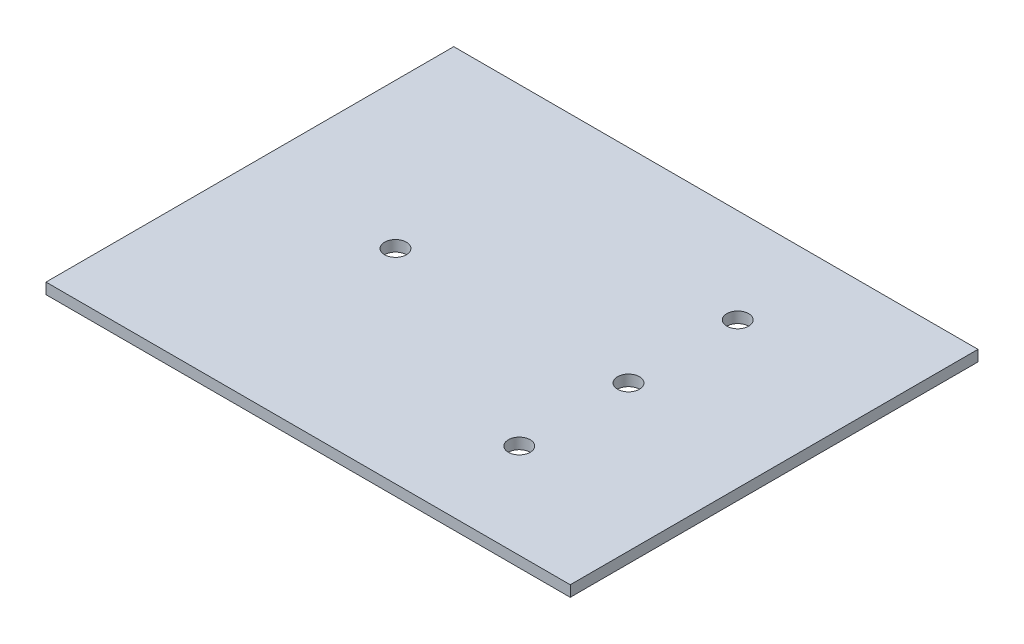
ISO-10303-21;
HEADER;
FILE_DESCRIPTION(('STEP AP214'),'2;1');
FILE_NAME('part.step','',(''),(''),'','','');
FILE_SCHEMA(('AUTOMOTIVE_DESIGN { 1 0 10303 214 1 1 1 1 }'));
ENDSEC;
DATA;
#1=APPLICATION_CONTEXT('core data for automotive mechanical design processes');
#2=APPLICATION_PROTOCOL_DEFINITION('international standard','automotive_design',2000,#1);
#3=PRODUCT_CONTEXT('',#1,'mechanical');
#4=PRODUCT('Part','Part','',(#3));
#5=PRODUCT_RELATED_PRODUCT_CATEGORY('part','',(#4));
#6=PRODUCT_DEFINITION_FORMATION('','',#4);
#7=PRODUCT_DEFINITION_CONTEXT('part definition',#1,'design');
#8=PRODUCT_DEFINITION('design','',#6,#7);
#9=PRODUCT_DEFINITION_SHAPE('','',#8);
#10=(LENGTH_UNIT() NAMED_UNIT(*) SI_UNIT(.MILLI.,.METRE.));
#11=(NAMED_UNIT(*) PLANE_ANGLE_UNIT() SI_UNIT($,.RADIAN.));
#12=(NAMED_UNIT(*) SI_UNIT($,.STERADIAN.) SOLID_ANGLE_UNIT());
#13=UNCERTAINTY_MEASURE_WITH_UNIT(LENGTH_MEASURE(1.E-05),#10,'distance_accuracy_value','');
#14=(GEOMETRIC_REPRESENTATION_CONTEXT(3) GLOBAL_UNCERTAINTY_ASSIGNED_CONTEXT((#13)) GLOBAL_UNIT_ASSIGNED_CONTEXT((#10,
#11,#12)) REPRESENTATION_CONTEXT('',''));
#15=CARTESIAN_POINT('',(0.,0.,0.));
#16=DIRECTION('',(0.,0.,1.));
#17=DIRECTION('',(1.,0.,0.));
#18=AXIS2_PLACEMENT_3D('',#15,#16,#17);
#19=CARTESIAN_POINT('',(-912.372794199772,9.525,-177.8));
#20=DIRECTION('',(0.,0.,-1.));
#21=DIRECTION('',(-1.,0.,0.));
#22=AXIS2_PLACEMENT_3D('',#19,#20,#21);
#23=PLANE('',#22);
#24=DIRECTION('',(1.,0.,0.));
#25=VECTOR('',#24,1.);
#26=CARTESIAN_POINT('',(-912.372794199772,0.,-177.8));
#27=LINE('',#26,#25);
#28=CARTESIAN_POINT('',(165.1,0.,-177.8));
#29=VERTEX_POINT('',#28);
#30=CARTESIAN_POINT('',(622.3,0.,-177.8));
#31=VERTEX_POINT('',#30);
#32=EDGE_CURVE('E40',#29,#31,#27,.T.);
#33=ORIENTED_EDGE('',*,*,#32,.F.);
#34=DIRECTION('',(0.,-1.,0.));
#35=VECTOR('',#34,1.);
#36=CARTESIAN_POINT('',(165.1,9.525,-177.8));
#37=LINE('',#36,#35);
#38=CARTESIAN_POINT('',(165.1,9.525,-177.8));
#39=VERTEX_POINT('',#38);
#40=EDGE_CURVE('E107',#39,#29,#37,.T.);
#41=ORIENTED_EDGE('',*,*,#40,.F.);
#42=DIRECTION('',(1.,0.,0.));
#43=VECTOR('',#42,1.);
#44=CARTESIAN_POINT('',(-912.372794199772,9.525,-177.8));
#45=LINE('',#44,#43);
#46=CARTESIAN_POINT('',(622.3,9.525,-177.8));
#47=VERTEX_POINT('',#46);
#48=EDGE_CURVE('E11',#39,#47,#45,.T.);
#49=ORIENTED_EDGE('',*,*,#48,.T.);
#50=DIRECTION('',(0.,-1.,0.));
#51=VECTOR('',#50,1.);
#52=CARTESIAN_POINT('',(622.3,9.525,-177.8));
#53=LINE('',#52,#51);
#54=EDGE_CURVE('E84',#47,#31,#53,.T.);
#55=ORIENTED_EDGE('',*,*,#54,.T.);
#56=EDGE_LOOP('',(#33,#41,#49,#55));
#57=FACE_BOUND('',#56,.T.);
#58=ADVANCED_FACE('F37',(#57),#23,.T.);
#59=CARTESIAN_POINT('',(-912.372794199772,9.525,0.));
#60=DIRECTION('',(0.,1.,0.));
#61=DIRECTION('',(0.,0.,1.));
#62=AXIS2_PLACEMENT_3D('',#59,#60,#61);
#63=PLANE('',#62);
#64=CARTESIAN_POINT('',(495.3,9.525,95.25));
#65=DIRECTION('',(0.,-1.,0.));
#66=DIRECTION('',(0.,0.,-1.));
#67=AXIS2_PLACEMENT_3D('',#64,#65,#66);
#68=CIRCLE('',#67,9.52500000000002);
#69=CARTESIAN_POINT('',(495.3,9.525,85.725));
#70=VERTEX_POINT('',#69);
#71=EDGE_CURVE('E153',#70,#70,#68,.T.);
#72=ORIENTED_EDGE('',*,*,#71,.T.);
#73=EDGE_LOOP('',(#72));
#74=FACE_BOUND('',#73,.T.);
#75=CARTESIAN_POINT('',(495.3,9.525,0.));
#76=DIRECTION('',(0.,-1.,0.));
#77=DIRECTION('',(0.,0.,-1.));
#78=AXIS2_PLACEMENT_3D('',#75,#76,#77);
#79=CIRCLE('',#78,9.52500000000002);
#80=CARTESIAN_POINT('',(495.3,9.525,-9.52500000000002));
#81=VERTEX_POINT('',#80);
#82=EDGE_CURVE('E161',#81,#81,#79,.T.);
#83=ORIENTED_EDGE('',*,*,#82,.T.);
#84=EDGE_LOOP('',(#83));
#85=FACE_BOUND('',#84,.T.);
#86=CARTESIAN_POINT('',(495.3,9.525,-95.25));
#87=DIRECTION('',(0.,-1.,0.));
#88=DIRECTION('',(0.,0.,-1.));
#89=AXIS2_PLACEMENT_3D('',#86,#87,#88);
#90=CIRCLE('',#89,9.52500000000002);
#91=CARTESIAN_POINT('',(495.3,9.525,-104.775));
#92=VERTEX_POINT('',#91);
#93=EDGE_CURVE('E167',#92,#92,#90,.T.);
#94=ORIENTED_EDGE('',*,*,#93,.T.);
#95=EDGE_LOOP('',(#94));
#96=FACE_BOUND('',#95,.T.);
#97=CARTESIAN_POINT('',(292.1,9.525,0.));
#98=DIRECTION('',(0.,-1.,0.));
#99=DIRECTION('',(0.,0.,-1.));
#100=AXIS2_PLACEMENT_3D('',#97,#98,#99);
#101=CIRCLE('',#100,9.52500000000002);
#102=CARTESIAN_POINT('',(292.1,9.525,-9.52500000000002));
#103=VERTEX_POINT('',#102);
#104=EDGE_CURVE('E93',#103,#103,#101,.T.);
#105=ORIENTED_EDGE('',*,*,#104,.T.);
#106=EDGE_LOOP('',(#105));
#107=FACE_BOUND('',#106,.T.);
#108=ORIENTED_EDGE('',*,*,#48,.F.);
#109=DIRECTION('',(0.,0.,-1.));
#110=VECTOR('',#109,1.);
#111=CARTESIAN_POINT('',(165.1,9.525,-450.66038433116));
#112=LINE('',#111,#110);
#113=CARTESIAN_POINT('',(165.1,9.525,177.8));
#114=VERTEX_POINT('',#113);
#115=EDGE_CURVE('E102',#114,#39,#112,.T.);
#116=ORIENTED_EDGE('',*,*,#115,.F.);
#117=DIRECTION('',(1.,0.,0.));
#118=VECTOR('',#117,1.);
#119=CARTESIAN_POINT('',(-912.372794199772,9.525,177.8));
#120=LINE('',#119,#118);
#121=CARTESIAN_POINT('',(622.3,9.525,177.8));
#122=VERTEX_POINT('',#121);
#123=EDGE_CURVE('E82',#114,#122,#120,.T.);
#124=ORIENTED_EDGE('',*,*,#123,.T.);
#125=DIRECTION('',(0.,0.,-1.));
#126=VECTOR('',#125,1.);
#127=CARTESIAN_POINT('',(622.299999999999,9.525,-450.66038433116));
#128=LINE('',#127,#126);
#129=EDGE_CURVE('E92',#122,#47,#128,.T.);
#130=ORIENTED_EDGE('',*,*,#129,.T.);
#131=EDGE_LOOP('',(#108,#116,#124,#130));
#132=FACE_BOUND('',#131,.T.);
#133=ADVANCED_FACE('F116',(#74,#85,#96,#107,#132),#63,.T.);
#134=CARTESIAN_POINT('',(-912.372794199772,0.,0.));
#135=DIRECTION('',(0.,1.,0.));
#136=DIRECTION('',(0.,0.,1.));
#137=AXIS2_PLACEMENT_3D('',#134,#135,#136);
#138=PLANE('',#137);
#139=CARTESIAN_POINT('',(495.3,0.,95.25));
#140=DIRECTION('',(0.,-1.,0.));
#141=DIRECTION('',(0.,0.,-1.));
#142=AXIS2_PLACEMENT_3D('',#139,#140,#141);
#143=CIRCLE('',#142,9.52500000000002);
#144=CARTESIAN_POINT('',(495.3,0.,85.725));
#145=VERTEX_POINT('',#144);
#146=EDGE_CURVE('E156',#145,#145,#143,.T.);
#147=ORIENTED_EDGE('',*,*,#146,.F.);
#148=EDGE_LOOP('',(#147));
#149=FACE_BOUND('',#148,.T.);
#150=CARTESIAN_POINT('',(495.3,0.,0.));
#151=DIRECTION('',(0.,-1.,0.));
#152=DIRECTION('',(0.,0.,-1.));
#153=AXIS2_PLACEMENT_3D('',#150,#151,#152);
#154=CIRCLE('',#153,9.52500000000002);
#155=CARTESIAN_POINT('',(495.3,0.,-9.52500000000002));
#156=VERTEX_POINT('',#155);
#157=EDGE_CURVE('E158',#156,#156,#154,.T.);
#158=ORIENTED_EDGE('',*,*,#157,.F.);
#159=EDGE_LOOP('',(#158));
#160=FACE_BOUND('',#159,.T.);
#161=CARTESIAN_POINT('',(495.3,0.,-95.25));
#162=DIRECTION('',(0.,-1.,0.));
#163=DIRECTION('',(0.,0.,-1.));
#164=AXIS2_PLACEMENT_3D('',#161,#162,#163);
#165=CIRCLE('',#164,9.52500000000002);
#166=CARTESIAN_POINT('',(495.3,0.,-104.775));
#167=VERTEX_POINT('',#166);
#168=EDGE_CURVE('E164',#167,#167,#165,.T.);
#169=ORIENTED_EDGE('',*,*,#168,.F.);
#170=EDGE_LOOP('',(#169));
#171=FACE_BOUND('',#170,.T.);
#172=CARTESIAN_POINT('',(292.1,0.,0.));
#173=DIRECTION('',(0.,-1.,0.));
#174=DIRECTION('',(0.,0.,-1.));
#175=AXIS2_PLACEMENT_3D('',#172,#173,#174);
#176=CIRCLE('',#175,9.52500000000002);
#177=CARTESIAN_POINT('',(292.1,0.,-9.52500000000002));
#178=VERTEX_POINT('',#177);
#179=EDGE_CURVE('E97',#178,#178,#176,.T.);
#180=ORIENTED_EDGE('',*,*,#179,.F.);
#181=EDGE_LOOP('',(#180));
#182=FACE_BOUND('',#181,.T.);
#183=DIRECTION('',(1.,0.,0.));
#184=VECTOR('',#183,1.);
#185=CARTESIAN_POINT('',(-912.372794199772,0.,177.8));
#186=LINE('',#185,#184);
#187=CARTESIAN_POINT('',(165.1,0.,177.8));
#188=VERTEX_POINT('',#187);
#189=CARTESIAN_POINT('',(622.3,0.,177.8));
#190=VERTEX_POINT('',#189);
#191=EDGE_CURVE('E63',#188,#190,#186,.T.);
#192=ORIENTED_EDGE('',*,*,#191,.F.);
#193=DIRECTION('',(0.,0.,-1.));
#194=VECTOR('',#193,1.);
#195=CARTESIAN_POINT('',(165.1,0.,-450.66038433116));
#196=LINE('',#195,#194);
#197=EDGE_CURVE('E80',#188,#29,#196,.T.);
#198=ORIENTED_EDGE('',*,*,#197,.T.);
#199=ORIENTED_EDGE('',*,*,#32,.T.);
#200=DIRECTION('',(0.,0.,-1.));
#201=VECTOR('',#200,1.);
#202=CARTESIAN_POINT('',(622.299999999999,0.,-450.66038433116));
#203=LINE('',#202,#201);
#204=EDGE_CURVE('E78',#190,#31,#203,.T.);
#205=ORIENTED_EDGE('',*,*,#204,.F.);
#206=EDGE_LOOP('',(#192,#198,#199,#205));
#207=FACE_BOUND('',#206,.T.);
#208=ADVANCED_FACE('F76',(#149,#160,#171,#182,#207),#138,.F.);
#209=CARTESIAN_POINT('',(-912.372794199772,9.525,177.8));
#210=DIRECTION('',(0.,0.,-1.));
#211=DIRECTION('',(-1.,0.,0.));
#212=AXIS2_PLACEMENT_3D('',#209,#210,#211);
#213=PLANE('',#212);
#214=ORIENTED_EDGE('',*,*,#191,.T.);
#215=DIRECTION('',(0.,-1.,0.));
#216=VECTOR('',#215,1.);
#217=CARTESIAN_POINT('',(622.3,9.525,177.8));
#218=LINE('',#217,#216);
#219=EDGE_CURVE('E87',#122,#190,#218,.T.);
#220=ORIENTED_EDGE('',*,*,#219,.F.);
#221=ORIENTED_EDGE('',*,*,#123,.F.);
#222=DIRECTION('',(0.,-1.,0.));
#223=VECTOR('',#222,1.);
#224=CARTESIAN_POINT('',(165.1,9.525,177.8));
#225=LINE('',#224,#223);
#226=EDGE_CURVE('E105',#114,#188,#225,.T.);
#227=ORIENTED_EDGE('',*,*,#226,.T.);
#228=EDGE_LOOP('',(#214,#220,#221,#227));
#229=FACE_BOUND('',#228,.T.);
#230=ADVANCED_FACE('F112',(#229),#213,.F.);
#231=CARTESIAN_POINT('',(165.1,9.525,-450.66038433116));
#232=DIRECTION('',(-1.,0.,0.));
#233=DIRECTION('',(0.,0.,1.));
#234=AXIS2_PLACEMENT_3D('',#231,#232,#233);
#235=PLANE('',#234);
#236=ORIENTED_EDGE('',*,*,#197,.F.);
#237=ORIENTED_EDGE('',*,*,#226,.F.);
#238=ORIENTED_EDGE('',*,*,#115,.T.);
#239=ORIENTED_EDGE('',*,*,#40,.T.);
#240=EDGE_LOOP('',(#236,#237,#238,#239));
#241=FACE_BOUND('',#240,.T.);
#242=ADVANCED_FACE('F115',(#241),#235,.T.);
#243=CARTESIAN_POINT('',(622.299999999999,9.525,-450.66038433116));
#244=DIRECTION('',(-1.,0.,0.));
#245=DIRECTION('',(0.,0.,1.));
#246=AXIS2_PLACEMENT_3D('',#243,#244,#245);
#247=PLANE('',#246);
#248=ORIENTED_EDGE('',*,*,#204,.T.);
#249=ORIENTED_EDGE('',*,*,#54,.F.);
#250=ORIENTED_EDGE('',*,*,#129,.F.);
#251=ORIENTED_EDGE('',*,*,#219,.T.);
#252=EDGE_LOOP('',(#248,#249,#250,#251));
#253=FACE_BOUND('',#252,.T.);
#254=ADVANCED_FACE('F90',(#253),#247,.F.);
#255=CARTESIAN_POINT('',(292.1,9.525,0.));
#256=DIRECTION('',(0.,-1.,0.));
#257=DIRECTION('',(0.,0.,-1.));
#258=AXIS2_PLACEMENT_3D('',#255,#256,#257);
#259=CYLINDRICAL_SURFACE('',#258,9.52500000000002);
#260=CARTESIAN_POINT('',(292.1,9.525,-9.52500000000002));
#261=CARTESIAN_POINT('',(292.1,9.42578125,-9.52500000000002));
#262=CARTESIAN_POINT('',(292.1,9.3265625,-9.52500000000002));
#263=CARTESIAN_POINT('',(292.1,9.128125,-9.52500000000002));
#264=CARTESIAN_POINT('',(292.1,9.02890625,-9.52500000000002));
#265=CARTESIAN_POINT('',(292.1,8.83046875,-9.52500000000002));
#266=CARTESIAN_POINT('',(292.1,8.73125,-9.52500000000002));
#267=CARTESIAN_POINT('',(292.1,8.5328125,-9.52500000000002));
#268=CARTESIAN_POINT('',(292.1,8.43359375,-9.52500000000002));
#269=CARTESIAN_POINT('',(292.1,8.23515625,-9.52500000000002));
#270=CARTESIAN_POINT('',(292.1,8.1359375,-9.52500000000002));
#271=CARTESIAN_POINT('',(292.1,7.9375,-9.52500000000002));
#272=CARTESIAN_POINT('',(292.1,7.83828125,-9.52500000000002));
#273=CARTESIAN_POINT('',(292.1,7.63984375,-9.52500000000002));
#274=CARTESIAN_POINT('',(292.1,7.540625,-9.52500000000002));
#275=CARTESIAN_POINT('',(292.1,7.3421875,-9.52500000000002));
#276=CARTESIAN_POINT('',(292.1,7.24296875,-9.52500000000002));
#277=CARTESIAN_POINT('',(292.1,7.04453125,-9.52500000000002));
#278=CARTESIAN_POINT('',(292.1,6.9453125,-9.52500000000002));
#279=CARTESIAN_POINT('',(292.1,6.746875,-9.52500000000002));
#280=CARTESIAN_POINT('',(292.1,6.64765625,-9.52500000000002));
#281=CARTESIAN_POINT('',(292.1,6.44921875,-9.52500000000002));
#282=CARTESIAN_POINT('',(292.1,6.35,-9.52500000000002));
#283=CARTESIAN_POINT('',(292.1,6.1515625,-9.52500000000002));
#284=CARTESIAN_POINT('',(292.1,6.05234375,-9.52500000000002));
#285=CARTESIAN_POINT('',(292.1,5.85390625,-9.52500000000002));
#286=CARTESIAN_POINT('',(292.1,5.7546875,-9.52500000000002));
#287=CARTESIAN_POINT('',(292.1,5.55625,-9.52500000000002));
#288=CARTESIAN_POINT('',(292.1,5.45703125,-9.52500000000002));
#289=CARTESIAN_POINT('',(292.1,5.25859375,-9.52500000000002));
#290=CARTESIAN_POINT('',(292.1,5.159375,-9.52500000000002));
#291=CARTESIAN_POINT('',(292.1,4.9609375,-9.52500000000002));
#292=CARTESIAN_POINT('',(292.1,4.86171875,-9.52500000000002));
#293=CARTESIAN_POINT('',(292.1,4.66328125,-9.52500000000002));
#294=CARTESIAN_POINT('',(292.1,4.5640625,-9.52500000000002));
#295=CARTESIAN_POINT('',(292.1,4.365625,-9.52500000000002));
#296=CARTESIAN_POINT('',(292.1,4.26640625,-9.52500000000002));
#297=CARTESIAN_POINT('',(292.1,4.06796875,-9.52500000000002));
#298=CARTESIAN_POINT('',(292.1,3.96875,-9.52500000000002));
#299=CARTESIAN_POINT('',(292.1,3.7703125,-9.52500000000002));
#300=CARTESIAN_POINT('',(292.1,3.67109375,-9.52500000000002));
#301=CARTESIAN_POINT('',(292.1,3.47265625,-9.52500000000002));
#302=CARTESIAN_POINT('',(292.1,3.3734375,-9.52500000000002));
#303=CARTESIAN_POINT('',(292.1,3.175,-9.52500000000002));
#304=CARTESIAN_POINT('',(292.1,3.07578125,-9.52500000000002));
#305=CARTESIAN_POINT('',(292.1,2.87734375,-9.52500000000002));
#306=CARTESIAN_POINT('',(292.1,2.778125,-9.52500000000002));
#307=CARTESIAN_POINT('',(292.1,2.5796875,-9.52500000000002));
#308=CARTESIAN_POINT('',(292.1,2.48046875,-9.52500000000002));
#309=CARTESIAN_POINT('',(292.1,2.28203125,-9.52500000000002));
#310=CARTESIAN_POINT('',(292.1,2.1828125,-9.52500000000002));
#311=CARTESIAN_POINT('',(292.1,1.984375,-9.52500000000002));
#312=CARTESIAN_POINT('',(292.1,1.88515625,-9.52500000000002));
#313=CARTESIAN_POINT('',(292.1,1.68671875,-9.52500000000002));
#314=CARTESIAN_POINT('',(292.1,1.5875,-9.52500000000002));
#315=CARTESIAN_POINT('',(292.1,1.3890625,-9.52500000000002));
#316=CARTESIAN_POINT('',(292.1,1.28984375,-9.52500000000002));
#317=CARTESIAN_POINT('',(292.1,1.09140625,-9.52500000000002));
#318=CARTESIAN_POINT('',(292.1,0.992187500000001,-9.52500000000002));
#319=CARTESIAN_POINT('',(292.1,0.793750000000001,-9.52500000000002));
#320=CARTESIAN_POINT('',(292.1,0.69453125,-9.52500000000002));
#321=CARTESIAN_POINT('',(292.1,0.49609375,-9.52500000000002));
#322=CARTESIAN_POINT('',(292.1,0.396875,-9.52500000000002));
#323=CARTESIAN_POINT('',(292.1,0.1984375,-9.52500000000002));
#324=CARTESIAN_POINT('',(292.1,0.0992187500000001,-9.52500000000002));
#325=CARTESIAN_POINT('',(292.1,0.,-9.52500000000002));
#326=B_SPLINE_CURVE_WITH_KNOTS('',3,(#260,#261,#262,#263,#264,#265,#266,#267,#268,#269,#270,
#271,#272,#273,#274,#275,#276,#277,#278,#279,#280,#281,#282,#283,#284,#285,#286,#287,#288,#289,
#290,#291,#292,#293,#294,#295,#296,#297,#298,#299,#300,#301,#302,#303,#304,#305,#306,#307,#308,
#309,#310,#311,#312,#313,#314,#315,#316,#317,#318,#319,#320,#321,#322,#323,#324,#325),
.UNSPECIFIED.,.F.,.F.,(4,2,2,2,2,2,2,2,2,2,2,2,2,2,2,2,2,2,2,2,2,2,2,2,2,2,2,2,2,2,2,2,4),(0.,
0.29765625,0.5953125,0.892968750000001,1.190625,1.48828125,1.7859375,2.08359375,2.38125,
2.67890625,2.9765625,3.27421875,3.571875,3.86953125,4.1671875,4.46484375,4.7625,5.06015625,
5.3578125,5.65546875,5.953125,6.25078125,6.5484375,6.84609375,7.14375,7.44140625,7.7390625,
8.03671875,8.334375,8.63203125,8.9296875,9.22734375,9.525),.UNSPECIFIED.);
#327=EDGE_CURVE('BSEAM134',#103,#178,#326,.T.);
#328=ORIENTED_EDGE('',*,*,#104,.F.);
#329=ORIENTED_EDGE('',*,*,#179,.T.);
#330=ORIENTED_EDGE('',*,*,#327,.T.);
#331=ORIENTED_EDGE('',*,*,#327,.F.);
#332=EDGE_LOOP('',(#328,#330,#329,#331));
#333=FACE_BOUND('',#332,.T.);
#334=ADVANCED_FACE('F134',(#333),#259,.F.);
#335=CARTESIAN_POINT('',(495.3,9.525,-95.25));
#336=DIRECTION('',(0.,-1.,0.));
#337=DIRECTION('',(0.,0.,-1.));
#338=AXIS2_PLACEMENT_3D('',#335,#336,#337);
#339=CYLINDRICAL_SURFACE('',#338,9.52500000000002);
#340=CARTESIAN_POINT('',(495.3,9.525,-104.775));
#341=CARTESIAN_POINT('',(495.3,9.42578125,-104.775));
#342=CARTESIAN_POINT('',(495.3,9.3265625,-104.775));
#343=CARTESIAN_POINT('',(495.3,9.128125,-104.775));
#344=CARTESIAN_POINT('',(495.3,9.02890625,-104.775));
#345=CARTESIAN_POINT('',(495.3,8.83046875,-104.775));
#346=CARTESIAN_POINT('',(495.3,8.73125,-104.775));
#347=CARTESIAN_POINT('',(495.3,8.5328125,-104.775));
#348=CARTESIAN_POINT('',(495.3,8.43359375,-104.775));
#349=CARTESIAN_POINT('',(495.3,8.23515625,-104.775));
#350=CARTESIAN_POINT('',(495.3,8.1359375,-104.775));
#351=CARTESIAN_POINT('',(495.3,7.9375,-104.775));
#352=CARTESIAN_POINT('',(495.3,7.83828125,-104.775));
#353=CARTESIAN_POINT('',(495.3,7.63984375,-104.775));
#354=CARTESIAN_POINT('',(495.3,7.540625,-104.775));
#355=CARTESIAN_POINT('',(495.3,7.3421875,-104.775));
#356=CARTESIAN_POINT('',(495.3,7.24296875,-104.775));
#357=CARTESIAN_POINT('',(495.3,7.04453125,-104.775));
#358=CARTESIAN_POINT('',(495.3,6.9453125,-104.775));
#359=CARTESIAN_POINT('',(495.3,6.746875,-104.775));
#360=CARTESIAN_POINT('',(495.3,6.64765625,-104.775));
#361=CARTESIAN_POINT('',(495.3,6.44921875,-104.775));
#362=CARTESIAN_POINT('',(495.3,6.35,-104.775));
#363=CARTESIAN_POINT('',(495.3,6.1515625,-104.775));
#364=CARTESIAN_POINT('',(495.3,6.05234375,-104.775));
#365=CARTESIAN_POINT('',(495.3,5.85390625,-104.775));
#366=CARTESIAN_POINT('',(495.3,5.7546875,-104.775));
#367=CARTESIAN_POINT('',(495.3,5.55625,-104.775));
#368=CARTESIAN_POINT('',(495.3,5.45703125,-104.775));
#369=CARTESIAN_POINT('',(495.3,5.25859375,-104.775));
#370=CARTESIAN_POINT('',(495.3,5.159375,-104.775));
#371=CARTESIAN_POINT('',(495.3,4.9609375,-104.775));
#372=CARTESIAN_POINT('',(495.3,4.86171875,-104.775));
#373=CARTESIAN_POINT('',(495.3,4.66328125,-104.775));
#374=CARTESIAN_POINT('',(495.3,4.5640625,-104.775));
#375=CARTESIAN_POINT('',(495.3,4.365625,-104.775));
#376=CARTESIAN_POINT('',(495.3,4.26640625,-104.775));
#377=CARTESIAN_POINT('',(495.3,4.06796875,-104.775));
#378=CARTESIAN_POINT('',(495.3,3.96875,-104.775));
#379=CARTESIAN_POINT('',(495.3,3.7703125,-104.775));
#380=CARTESIAN_POINT('',(495.3,3.67109375,-104.775));
#381=CARTESIAN_POINT('',(495.3,3.47265625,-104.775));
#382=CARTESIAN_POINT('',(495.3,3.3734375,-104.775));
#383=CARTESIAN_POINT('',(495.3,3.175,-104.775));
#384=CARTESIAN_POINT('',(495.3,3.07578125,-104.775));
#385=CARTESIAN_POINT('',(495.3,2.87734375,-104.775));
#386=CARTESIAN_POINT('',(495.3,2.778125,-104.775));
#387=CARTESIAN_POINT('',(495.3,2.5796875,-104.775));
#388=CARTESIAN_POINT('',(495.3,2.48046875,-104.775));
#389=CARTESIAN_POINT('',(495.3,2.28203125,-104.775));
#390=CARTESIAN_POINT('',(495.3,2.1828125,-104.775));
#391=CARTESIAN_POINT('',(495.3,1.984375,-104.775));
#392=CARTESIAN_POINT('',(495.3,1.88515625,-104.775));
#393=CARTESIAN_POINT('',(495.3,1.68671875,-104.775));
#394=CARTESIAN_POINT('',(495.3,1.5875,-104.775));
#395=CARTESIAN_POINT('',(495.3,1.3890625,-104.775));
#396=CARTESIAN_POINT('',(495.3,1.28984375,-104.775));
#397=CARTESIAN_POINT('',(495.3,1.09140625,-104.775));
#398=CARTESIAN_POINT('',(495.3,0.992187500000001,-104.775));
#399=CARTESIAN_POINT('',(495.3,0.793750000000001,-104.775));
#400=CARTESIAN_POINT('',(495.3,0.69453125,-104.775));
#401=CARTESIAN_POINT('',(495.3,0.49609375,-104.775));
#402=CARTESIAN_POINT('',(495.3,0.396875,-104.775));
#403=CARTESIAN_POINT('',(495.3,0.1984375,-104.775));
#404=CARTESIAN_POINT('',(495.3,0.0992187500000001,-104.775));
#405=CARTESIAN_POINT('',(495.3,0.,-104.775));
#406=B_SPLINE_CURVE_WITH_KNOTS('',3,(#340,#341,#342,#343,#344,#345,#346,#347,#348,#349,#350,
#351,#352,#353,#354,#355,#356,#357,#358,#359,#360,#361,#362,#363,#364,#365,#366,#367,#368,#369,
#370,#371,#372,#373,#374,#375,#376,#377,#378,#379,#380,#381,#382,#383,#384,#385,#386,#387,#388,
#389,#390,#391,#392,#393,#394,#395,#396,#397,#398,#399,#400,#401,#402,#403,#404,#405),
.UNSPECIFIED.,.F.,.F.,(4,2,2,2,2,2,2,2,2,2,2,2,2,2,2,2,2,2,2,2,2,2,2,2,2,2,2,2,2,2,2,2,4),(0.,
0.29765625,0.5953125,0.892968750000001,1.190625,1.48828125,1.7859375,2.08359375,2.38125,
2.67890625,2.9765625,3.27421875,3.571875,3.86953125,4.1671875,4.46484375,4.7625,5.06015625,
5.3578125,5.65546875,5.953125,6.25078125,6.5484375,6.84609375,7.14375,7.44140625,7.7390625,
8.03671875,8.334375,8.63203125,8.9296875,9.22734375,9.525),.UNSPECIFIED.);
#407=EDGE_CURVE('BSEAM137',#92,#167,#406,.T.);
#408=ORIENTED_EDGE('',*,*,#93,.F.);
#409=ORIENTED_EDGE('',*,*,#168,.T.);
#410=ORIENTED_EDGE('',*,*,#407,.T.);
#411=ORIENTED_EDGE('',*,*,#407,.F.);
#412=EDGE_LOOP('',(#408,#410,#409,#411));
#413=FACE_BOUND('',#412,.T.);
#414=ADVANCED_FACE('F137',(#413),#339,.F.);
#415=CARTESIAN_POINT('',(495.3,9.525,0.));
#416=DIRECTION('',(0.,-1.,0.));
#417=DIRECTION('',(0.,0.,-1.));
#418=AXIS2_PLACEMENT_3D('',#415,#416,#417);
#419=CYLINDRICAL_SURFACE('',#418,9.52500000000002);
#420=CARTESIAN_POINT('',(495.3,9.525,-9.52500000000002));
#421=CARTESIAN_POINT('',(495.3,9.42578125,-9.52500000000002));
#422=CARTESIAN_POINT('',(495.3,9.3265625,-9.52500000000002));
#423=CARTESIAN_POINT('',(495.3,9.128125,-9.52500000000002));
#424=CARTESIAN_POINT('',(495.3,9.02890625,-9.52500000000002));
#425=CARTESIAN_POINT('',(495.3,8.83046875,-9.52500000000002));
#426=CARTESIAN_POINT('',(495.3,8.73125,-9.52500000000002));
#427=CARTESIAN_POINT('',(495.3,8.5328125,-9.52500000000002));
#428=CARTESIAN_POINT('',(495.3,8.43359375,-9.52500000000002));
#429=CARTESIAN_POINT('',(495.3,8.23515625,-9.52500000000002));
#430=CARTESIAN_POINT('',(495.3,8.1359375,-9.52500000000002));
#431=CARTESIAN_POINT('',(495.3,7.9375,-9.52500000000002));
#432=CARTESIAN_POINT('',(495.3,7.83828125,-9.52500000000002));
#433=CARTESIAN_POINT('',(495.3,7.63984375,-9.52500000000002));
#434=CARTESIAN_POINT('',(495.3,7.540625,-9.52500000000002));
#435=CARTESIAN_POINT('',(495.3,7.3421875,-9.52500000000002));
#436=CARTESIAN_POINT('',(495.3,7.24296875,-9.52500000000002));
#437=CARTESIAN_POINT('',(495.3,7.04453125,-9.52500000000002));
#438=CARTESIAN_POINT('',(495.3,6.9453125,-9.52500000000002));
#439=CARTESIAN_POINT('',(495.3,6.746875,-9.52500000000002));
#440=CARTESIAN_POINT('',(495.3,6.64765625,-9.52500000000002));
#441=CARTESIAN_POINT('',(495.3,6.44921875,-9.52500000000002));
#442=CARTESIAN_POINT('',(495.3,6.35,-9.52500000000002));
#443=CARTESIAN_POINT('',(495.3,6.1515625,-9.52500000000002));
#444=CARTESIAN_POINT('',(495.3,6.05234375,-9.52500000000002));
#445=CARTESIAN_POINT('',(495.3,5.85390625,-9.52500000000002));
#446=CARTESIAN_POINT('',(495.3,5.7546875,-9.52500000000002));
#447=CARTESIAN_POINT('',(495.3,5.55625,-9.52500000000002));
#448=CARTESIAN_POINT('',(495.3,5.45703125,-9.52500000000002));
#449=CARTESIAN_POINT('',(495.3,5.25859375,-9.52500000000002));
#450=CARTESIAN_POINT('',(495.3,5.159375,-9.52500000000002));
#451=CARTESIAN_POINT('',(495.3,4.9609375,-9.52500000000002));
#452=CARTESIAN_POINT('',(495.3,4.86171875,-9.52500000000002));
#453=CARTESIAN_POINT('',(495.3,4.66328125,-9.52500000000002));
#454=CARTESIAN_POINT('',(495.3,4.5640625,-9.52500000000002));
#455=CARTESIAN_POINT('',(495.3,4.365625,-9.52500000000002));
#456=CARTESIAN_POINT('',(495.3,4.26640625,-9.52500000000002));
#457=CARTESIAN_POINT('',(495.3,4.06796875,-9.52500000000002));
#458=CARTESIAN_POINT('',(495.3,3.96875,-9.52500000000002));
#459=CARTESIAN_POINT('',(495.3,3.7703125,-9.52500000000002));
#460=CARTESIAN_POINT('',(495.3,3.67109375,-9.52500000000002));
#461=CARTESIAN_POINT('',(495.3,3.47265625,-9.52500000000002));
#462=CARTESIAN_POINT('',(495.3,3.3734375,-9.52500000000002));
#463=CARTESIAN_POINT('',(495.3,3.175,-9.52500000000002));
#464=CARTESIAN_POINT('',(495.3,3.07578125,-9.52500000000002));
#465=CARTESIAN_POINT('',(495.3,2.87734375,-9.52500000000002));
#466=CARTESIAN_POINT('',(495.3,2.778125,-9.52500000000002));
#467=CARTESIAN_POINT('',(495.3,2.5796875,-9.52500000000002));
#468=CARTESIAN_POINT('',(495.3,2.48046875,-9.52500000000002));
#469=CARTESIAN_POINT('',(495.3,2.28203125,-9.52500000000002));
#470=CARTESIAN_POINT('',(495.3,2.1828125,-9.52500000000002));
#471=CARTESIAN_POINT('',(495.3,1.984375,-9.52500000000002));
#472=CARTESIAN_POINT('',(495.3,1.88515625,-9.52500000000002));
#473=CARTESIAN_POINT('',(495.3,1.68671875,-9.52500000000002));
#474=CARTESIAN_POINT('',(495.3,1.5875,-9.52500000000002));
#475=CARTESIAN_POINT('',(495.3,1.3890625,-9.52500000000002));
#476=CARTESIAN_POINT('',(495.3,1.28984375,-9.52500000000002));
#477=CARTESIAN_POINT('',(495.3,1.09140625,-9.52500000000002));
#478=CARTESIAN_POINT('',(495.3,0.992187500000001,-9.52500000000002));
#479=CARTESIAN_POINT('',(495.3,0.793750000000001,-9.52500000000002));
#480=CARTESIAN_POINT('',(495.3,0.69453125,-9.52500000000002));
#481=CARTESIAN_POINT('',(495.3,0.49609375,-9.52500000000002));
#482=CARTESIAN_POINT('',(495.3,0.396875,-9.52500000000002));
#483=CARTESIAN_POINT('',(495.3,0.1984375,-9.52500000000002));
#484=CARTESIAN_POINT('',(495.3,0.0992187500000001,-9.52500000000002));
#485=CARTESIAN_POINT('',(495.3,0.,-9.52500000000002));
#486=B_SPLINE_CURVE_WITH_KNOTS('',3,(#420,#421,#422,#423,#424,#425,#426,#427,#428,#429,#430,
#431,#432,#433,#434,#435,#436,#437,#438,#439,#440,#441,#442,#443,#444,#445,#446,#447,#448,#449,
#450,#451,#452,#453,#454,#455,#456,#457,#458,#459,#460,#461,#462,#463,#464,#465,#466,#467,#468,
#469,#470,#471,#472,#473,#474,#475,#476,#477,#478,#479,#480,#481,#482,#483,#484,#485),
.UNSPECIFIED.,.F.,.F.,(4,2,2,2,2,2,2,2,2,2,2,2,2,2,2,2,2,2,2,2,2,2,2,2,2,2,2,2,2,2,2,2,4),(0.,
0.29765625,0.5953125,0.892968750000001,1.190625,1.48828125,1.7859375,2.08359375,2.38125,
2.67890625,2.9765625,3.27421875,3.571875,3.86953125,4.1671875,4.46484375,4.7625,5.06015625,
5.3578125,5.65546875,5.953125,6.25078125,6.5484375,6.84609375,7.14375,7.44140625,7.7390625,
8.03671875,8.334375,8.63203125,8.9296875,9.22734375,9.525),.UNSPECIFIED.);
#487=EDGE_CURVE('BSEAM141',#81,#156,#486,.T.);
#488=ORIENTED_EDGE('',*,*,#82,.F.);
#489=ORIENTED_EDGE('',*,*,#157,.T.);
#490=ORIENTED_EDGE('',*,*,#487,.T.);
#491=ORIENTED_EDGE('',*,*,#487,.F.);
#492=EDGE_LOOP('',(#488,#490,#489,#491));
#493=FACE_BOUND('',#492,.T.);
#494=ADVANCED_FACE('F141',(#493),#419,.F.);
#495=CARTESIAN_POINT('',(495.3,9.525,95.25));
#496=DIRECTION('',(0.,-1.,0.));
#497=DIRECTION('',(0.,0.,-1.));
#498=AXIS2_PLACEMENT_3D('',#495,#496,#497);
#499=CYLINDRICAL_SURFACE('',#498,9.52500000000002);
#500=CARTESIAN_POINT('',(495.3,9.525,85.725));
#501=CARTESIAN_POINT('',(495.3,9.42578125,85.725));
#502=CARTESIAN_POINT('',(495.3,9.3265625,85.725));
#503=CARTESIAN_POINT('',(495.3,9.128125,85.725));
#504=CARTESIAN_POINT('',(495.3,9.02890625,85.725));
#505=CARTESIAN_POINT('',(495.3,8.83046875,85.725));
#506=CARTESIAN_POINT('',(495.3,8.73125,85.725));
#507=CARTESIAN_POINT('',(495.3,8.5328125,85.725));
#508=CARTESIAN_POINT('',(495.3,8.43359375,85.725));
#509=CARTESIAN_POINT('',(495.3,8.23515625,85.725));
#510=CARTESIAN_POINT('',(495.3,8.1359375,85.725));
#511=CARTESIAN_POINT('',(495.3,7.9375,85.725));
#512=CARTESIAN_POINT('',(495.3,7.83828125,85.725));
#513=CARTESIAN_POINT('',(495.3,7.63984375,85.725));
#514=CARTESIAN_POINT('',(495.3,7.540625,85.725));
#515=CARTESIAN_POINT('',(495.3,7.3421875,85.725));
#516=CARTESIAN_POINT('',(495.3,7.24296875,85.725));
#517=CARTESIAN_POINT('',(495.3,7.04453125,85.725));
#518=CARTESIAN_POINT('',(495.3,6.9453125,85.725));
#519=CARTESIAN_POINT('',(495.3,6.746875,85.725));
#520=CARTESIAN_POINT('',(495.3,6.64765625,85.725));
#521=CARTESIAN_POINT('',(495.3,6.44921875,85.725));
#522=CARTESIAN_POINT('',(495.3,6.35,85.725));
#523=CARTESIAN_POINT('',(495.3,6.1515625,85.725));
#524=CARTESIAN_POINT('',(495.3,6.05234375,85.725));
#525=CARTESIAN_POINT('',(495.3,5.85390625,85.725));
#526=CARTESIAN_POINT('',(495.3,5.7546875,85.725));
#527=CARTESIAN_POINT('',(495.3,5.55625,85.725));
#528=CARTESIAN_POINT('',(495.3,5.45703125,85.725));
#529=CARTESIAN_POINT('',(495.3,5.25859375,85.725));
#530=CARTESIAN_POINT('',(495.3,5.159375,85.725));
#531=CARTESIAN_POINT('',(495.3,4.9609375,85.725));
#532=CARTESIAN_POINT('',(495.3,4.86171875,85.725));
#533=CARTESIAN_POINT('',(495.3,4.66328125,85.725));
#534=CARTESIAN_POINT('',(495.3,4.5640625,85.725));
#535=CARTESIAN_POINT('',(495.3,4.365625,85.725));
#536=CARTESIAN_POINT('',(495.3,4.26640625,85.725));
#537=CARTESIAN_POINT('',(495.3,4.06796875,85.725));
#538=CARTESIAN_POINT('',(495.3,3.96875,85.725));
#539=CARTESIAN_POINT('',(495.3,3.7703125,85.725));
#540=CARTESIAN_POINT('',(495.3,3.67109375,85.725));
#541=CARTESIAN_POINT('',(495.3,3.47265625,85.725));
#542=CARTESIAN_POINT('',(495.3,3.3734375,85.725));
#543=CARTESIAN_POINT('',(495.3,3.175,85.725));
#544=CARTESIAN_POINT('',(495.3,3.07578125,85.725));
#545=CARTESIAN_POINT('',(495.3,2.87734375,85.725));
#546=CARTESIAN_POINT('',(495.3,2.778125,85.725));
#547=CARTESIAN_POINT('',(495.3,2.5796875,85.725));
#548=CARTESIAN_POINT('',(495.3,2.48046875,85.725));
#549=CARTESIAN_POINT('',(495.3,2.28203125,85.725));
#550=CARTESIAN_POINT('',(495.3,2.1828125,85.725));
#551=CARTESIAN_POINT('',(495.3,1.984375,85.725));
#552=CARTESIAN_POINT('',(495.3,1.88515625,85.725));
#553=CARTESIAN_POINT('',(495.3,1.68671875,85.725));
#554=CARTESIAN_POINT('',(495.3,1.5875,85.725));
#555=CARTESIAN_POINT('',(495.3,1.3890625,85.725));
#556=CARTESIAN_POINT('',(495.3,1.28984375,85.725));
#557=CARTESIAN_POINT('',(495.3,1.09140625,85.725));
#558=CARTESIAN_POINT('',(495.3,0.992187500000001,85.725));
#559=CARTESIAN_POINT('',(495.3,0.793750000000001,85.725));
#560=CARTESIAN_POINT('',(495.3,0.69453125,85.725));
#561=CARTESIAN_POINT('',(495.3,0.49609375,85.725));
#562=CARTESIAN_POINT('',(495.3,0.396875,85.725));
#563=CARTESIAN_POINT('',(495.3,0.1984375,85.725));
#564=CARTESIAN_POINT('',(495.3,0.0992187500000001,85.725));
#565=CARTESIAN_POINT('',(495.3,0.,85.725));
#566=B_SPLINE_CURVE_WITH_KNOTS('',3,(#500,#501,#502,#503,#504,#505,#506,#507,#508,#509,#510,
#511,#512,#513,#514,#515,#516,#517,#518,#519,#520,#521,#522,#523,#524,#525,#526,#527,#528,#529,
#530,#531,#532,#533,#534,#535,#536,#537,#538,#539,#540,#541,#542,#543,#544,#545,#546,#547,#548,
#549,#550,#551,#552,#553,#554,#555,#556,#557,#558,#559,#560,#561,#562,#563,#564,#565),
.UNSPECIFIED.,.F.,.F.,(4,2,2,2,2,2,2,2,2,2,2,2,2,2,2,2,2,2,2,2,2,2,2,2,2,2,2,2,2,2,2,2,4),(0.,
0.29765625,0.5953125,0.892968750000001,1.190625,1.48828125,1.7859375,2.08359375,2.38125,
2.67890625,2.9765625,3.27421875,3.571875,3.86953125,4.1671875,4.46484375,4.7625,5.06015625,
5.3578125,5.65546875,5.953125,6.25078125,6.5484375,6.84609375,7.14375,7.44140625,7.7390625,
8.03671875,8.334375,8.63203125,8.9296875,9.22734375,9.525),.UNSPECIFIED.);
#567=EDGE_CURVE('BSEAM145',#70,#145,#566,.T.);
#568=ORIENTED_EDGE('',*,*,#71,.F.);
#569=ORIENTED_EDGE('',*,*,#146,.T.);
#570=ORIENTED_EDGE('',*,*,#567,.T.);
#571=ORIENTED_EDGE('',*,*,#567,.F.);
#572=EDGE_LOOP('',(#568,#570,#569,#571));
#573=FACE_BOUND('',#572,.T.);
#574=ADVANCED_FACE('F145',(#573),#499,.F.);
#575=CLOSED_SHELL('',(#58,#133,#208,#230,#242,#254,#334,#414,#494,#574));
#576=MANIFOLD_SOLID_BREP('B2',#575);
#577=ADVANCED_BREP_SHAPE_REPRESENTATION('',(#18,#576),#14);
#578=SHAPE_DEFINITION_REPRESENTATION(#9,#577);
ENDSEC;
END-ISO-10303-21;
